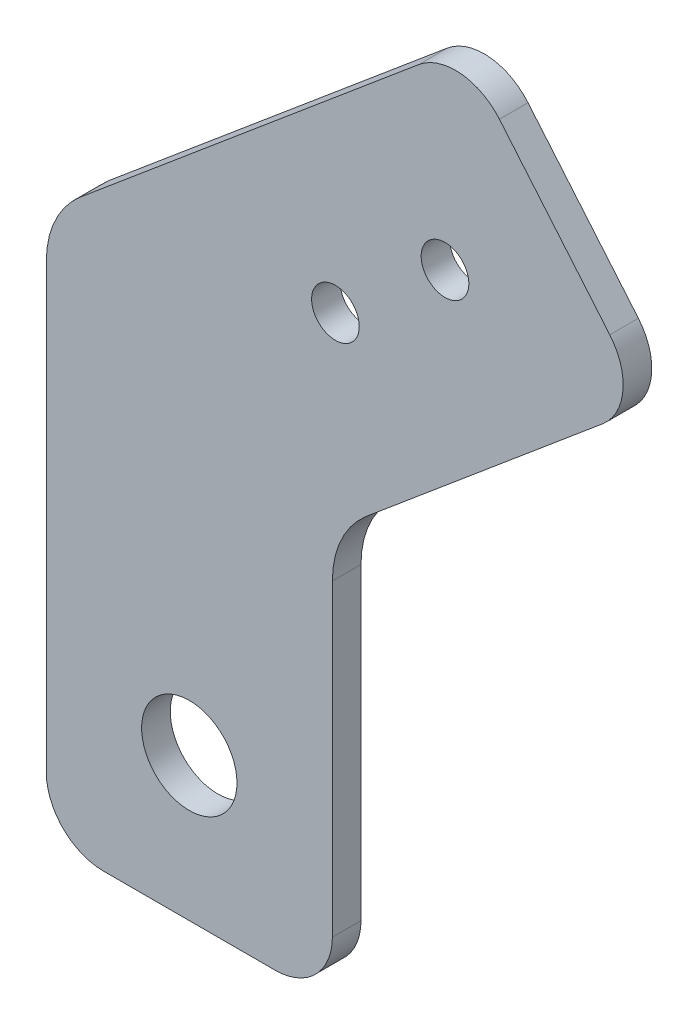
ISO-10303-21;
HEADER;
FILE_DESCRIPTION(('STEP AP214'),'2;1');
FILE_NAME('part.step','',(''),(''),'','','');
FILE_SCHEMA(('AUTOMOTIVE_DESIGN { 1 0 10303 214 1 1 1 1 }'));
ENDSEC;
DATA;
#1=APPLICATION_CONTEXT('core data for automotive mechanical design processes');
#2=APPLICATION_PROTOCOL_DEFINITION('international standard','automotive_design',2000,#1);
#3=PRODUCT_CONTEXT('',#1,'mechanical');
#4=PRODUCT('Part','Part','',(#3));
#5=PRODUCT_RELATED_PRODUCT_CATEGORY('part','',(#4));
#6=PRODUCT_DEFINITION_FORMATION('','',#4);
#7=PRODUCT_DEFINITION_CONTEXT('part definition',#1,'design');
#8=PRODUCT_DEFINITION('design','',#6,#7);
#9=PRODUCT_DEFINITION_SHAPE('','',#8);
#10=(LENGTH_UNIT() NAMED_UNIT(*) SI_UNIT(.MILLI.,.METRE.));
#11=(NAMED_UNIT(*) PLANE_ANGLE_UNIT() SI_UNIT($,.RADIAN.));
#12=(NAMED_UNIT(*) SI_UNIT($,.STERADIAN.) SOLID_ANGLE_UNIT());
#13=UNCERTAINTY_MEASURE_WITH_UNIT(LENGTH_MEASURE(1.E-05),#10,'distance_accuracy_value','');
#14=(GEOMETRIC_REPRESENTATION_CONTEXT(3) GLOBAL_UNCERTAINTY_ASSIGNED_CONTEXT((#13)) GLOBAL_UNIT_ASSIGNED_CONTEXT((#10,
#11,#12)) REPRESENTATION_CONTEXT('',''));
#15=CARTESIAN_POINT('',(0.,0.,0.));
#16=DIRECTION('',(0.,0.,1.));
#17=DIRECTION('',(1.,0.,0.));
#18=AXIS2_PLACEMENT_3D('',#15,#16,#17);
#19=CARTESIAN_POINT('',(-47.3022221559489,-76.1393804843269,-3.));
#20=DIRECTION('',(0.,0.,1.));
#21=DIRECTION('',(1.,0.,0.));
#22=AXIS2_PLACEMENT_3D('',#19,#20,#21);
#23=CYLINDRICAL_SURFACE('',#22,6.);
#24=CARTESIAN_POINT('',(-47.3022221559489,-76.1393804843269,0.));
#25=DIRECTION('',(0.,0.,1.));
#26=DIRECTION('',(-1.,0.,0.));
#27=AXIS2_PLACEMENT_3D('',#24,#25,#26);
#28=CIRCLE('',#27,6.);
#29=CARTESIAN_POINT('',(-53.3022221559489,-76.1393804843269,0.));
#30=VERTEX_POINT('',#29);
#31=CARTESIAN_POINT('',(-47.3022221559489,-82.1393804843269,0.));
#32=VERTEX_POINT('',#31);
#33=EDGE_CURVE('E156',#30,#32,#28,.T.);
#34=ORIENTED_EDGE('',*,*,#33,.F.);
#35=DIRECTION('',(0.,0.,1.));
#36=VECTOR('',#35,1.);
#37=CARTESIAN_POINT('',(-53.3022221559489,-76.1393804843269,-3.));
#38=LINE('',#37,#36);
#39=CARTESIAN_POINT('',(-53.3022221559489,-76.1393804843269,-3.));
#40=VERTEX_POINT('',#39);
#41=EDGE_CURVE('E11',#40,#30,#38,.T.);
#42=ORIENTED_EDGE('',*,*,#41,.F.);
#43=CARTESIAN_POINT('',(-47.3022221559489,-76.1393804843269,-3.));
#44=DIRECTION('',(0.,0.,1.));
#45=DIRECTION('',(-1.,0.,0.));
#46=AXIS2_PLACEMENT_3D('',#43,#44,#45);
#47=CIRCLE('',#46,6.);
#48=CARTESIAN_POINT('',(-47.3022221559489,-82.1393804843269,-3.));
#49=VERTEX_POINT('',#48);
#50=EDGE_CURVE('E187',#40,#49,#47,.T.);
#51=ORIENTED_EDGE('',*,*,#50,.T.);
#52=DIRECTION('',(0.,0.,1.));
#53=VECTOR('',#52,1.);
#54=CARTESIAN_POINT('',(-47.3022221559489,-82.1393804843269,-3.));
#55=LINE('',#54,#53);
#56=EDGE_CURVE('E38',#49,#32,#55,.T.);
#57=ORIENTED_EDGE('',*,*,#56,.T.);
#58=EDGE_LOOP('',(#34,#42,#51,#57));
#59=FACE_BOUND('',#58,.T.);
#60=ADVANCED_FACE('F35',(#59),#23,.T.);
#61=CARTESIAN_POINT('',(-53.3022221559489,-76.1393804843269,-3.));
#62=DIRECTION('',(-1.,0.,0.));
#63=DIRECTION('',(0.,0.,1.));
#64=AXIS2_PLACEMENT_3D('',#61,#62,#63);
#65=PLANE('',#64);
#66=DIRECTION('',(0.,-1.,0.));
#67=VECTOR('',#66,1.);
#68=CARTESIAN_POINT('',(-53.3022221559489,-76.1393804843269,0.));
#69=LINE('',#68,#67);
#70=CARTESIAN_POINT('',(-53.3022221559489,-29.8078421935519,0.));
#71=VERTEX_POINT('',#70);
#72=EDGE_CURVE('E90',#71,#30,#69,.T.);
#73=ORIENTED_EDGE('',*,*,#72,.F.);
#74=DIRECTION('',(0.,0.,1.));
#75=VECTOR('',#74,1.);
#76=CARTESIAN_POINT('',(-53.3022221559489,-29.8078421935519,-3.));
#77=LINE('',#76,#75);
#78=CARTESIAN_POINT('',(-53.3022221559489,-29.8078421935519,-3.));
#79=VERTEX_POINT('',#78);
#80=EDGE_CURVE('E44',#79,#71,#77,.T.);
#81=ORIENTED_EDGE('',*,*,#80,.F.);
#82=DIRECTION('',(0.,-1.,0.));
#83=VECTOR('',#82,1.);
#84=CARTESIAN_POINT('',(-53.3022221559489,-29.8078421935519,-3.));
#85=LINE('',#84,#83);
#86=EDGE_CURVE('E52',#79,#40,#85,.T.);
#87=ORIENTED_EDGE('',*,*,#86,.T.);
#88=ORIENTED_EDGE('',*,*,#41,.T.);
#89=EDGE_LOOP('',(#73,#81,#87,#88));
#90=FACE_BOUND('',#89,.T.);
#91=ADVANCED_FACE('F283',(#90),#65,.T.);
#92=CARTESIAN_POINT('',(-43.3022221559489,-29.8078421935519,-3.));
#93=DIRECTION('',(0.,0.,1.));
#94=DIRECTION('',(1.,0.,0.));
#95=AXIS2_PLACEMENT_3D('',#92,#93,#94);
#96=CYLINDRICAL_SURFACE('',#95,10.);
#97=CARTESIAN_POINT('',(-43.3022221559489,-29.8078421935519,0.));
#98=DIRECTION('',(0.,0.,1.));
#99=DIRECTION('',(1.,0.,0.));
#100=AXIS2_PLACEMENT_3D('',#97,#98,#99);
#101=CIRCLE('',#100,10.);
#102=CARTESIAN_POINT('',(-49.7300982528143,-22.1473977623621,0.));
#103=VERTEX_POINT('',#102);
#104=EDGE_CURVE('E133',#103,#71,#101,.T.);
#105=ORIENTED_EDGE('',*,*,#104,.F.);
#106=DIRECTION('',(0.,0.,1.));
#107=VECTOR('',#106,1.);
#108=CARTESIAN_POINT('',(-49.7300982528143,-22.1473977623621,-3.));
#109=LINE('',#108,#107);
#110=CARTESIAN_POINT('',(-49.7300982528143,-22.1473977623621,-3.));
#111=VERTEX_POINT('',#110);
#112=EDGE_CURVE('E128',#111,#103,#109,.T.);
#113=ORIENTED_EDGE('',*,*,#112,.F.);
#114=CARTESIAN_POINT('',(-43.3022221559489,-29.8078421935519,-3.));
#115=DIRECTION('',(0.,0.,1.));
#116=DIRECTION('',(1.,0.,0.));
#117=AXIS2_PLACEMENT_3D('',#114,#115,#116);
#118=CIRCLE('',#117,10.);
#119=EDGE_CURVE('E131',#111,#79,#118,.T.);
#120=ORIENTED_EDGE('',*,*,#119,.T.);
#121=ORIENTED_EDGE('',*,*,#80,.T.);
#122=EDGE_LOOP('',(#105,#113,#120,#121));
#123=FACE_BOUND('',#122,.T.);
#124=ADVANCED_FACE('F130',(#123),#96,.T.);
#125=CARTESIAN_POINT('',(-14.2380808040119,7.63394098866545,-3.));
#126=DIRECTION('',(-0.642787609686538,0.766044443118979,0.));
#127=DIRECTION('',(-0.766044443118979,-0.642787609686538,0.));
#128=AXIS2_PLACEMENT_3D('',#125,#126,#127);
#129=PLANE('',#128);
#130=DIRECTION('',(-0.766044443118979,-0.642787609686538,0.));
#131=VECTOR('',#130,1.);
#132=CARTESIAN_POINT('',(-14.2380808040119,7.63394098866545,0.));
#133=LINE('',#132,#131);
#134=CARTESIAN_POINT('',(-14.2380808040119,7.63394098866545,0.));
#135=VERTEX_POINT('',#134);
#136=EDGE_CURVE('E184',#135,#103,#133,.T.);
#137=ORIENTED_EDGE('',*,*,#136,.F.);
#138=DIRECTION('',(0.,0.,1.));
#139=VECTOR('',#138,1.);
#140=CARTESIAN_POINT('',(-14.2380808040119,7.63394098866545,-3.));
#141=LINE('',#140,#139);
#142=CARTESIAN_POINT('',(-14.2380808040119,7.63394098866545,-3.));
#143=VERTEX_POINT('',#142);
#144=EDGE_CURVE('E138',#143,#135,#141,.T.);
#145=ORIENTED_EDGE('',*,*,#144,.F.);
#146=DIRECTION('',(-0.766044443118979,-0.642787609686538,0.));
#147=VECTOR('',#146,1.);
#148=CARTESIAN_POINT('',(-14.2380808040119,7.63394098866545,-3.));
#149=LINE('',#148,#147);
#150=EDGE_CURVE('E145',#143,#111,#149,.T.);
#151=ORIENTED_EDGE('',*,*,#150,.T.);
#152=ORIENTED_EDGE('',*,*,#112,.T.);
#153=EDGE_LOOP('',(#137,#145,#151,#152));
#154=FACE_BOUND('',#153,.T.);
#155=ADVANCED_FACE('F148',(#154),#129,.T.);
#156=CARTESIAN_POINT('',(-10.3813551458927,3.03767432995158,-3.));
#157=DIRECTION('',(0.,0.,1.));
#158=DIRECTION('',(1.,0.,0.));
#159=AXIS2_PLACEMENT_3D('',#156,#157,#158);
#160=CYLINDRICAL_SURFACE('',#159,6.);
#161=CARTESIAN_POINT('',(-10.3813551458927,3.03767432995158,0.));
#162=DIRECTION('',(0.,0.,1.));
#163=DIRECTION('',(-1.,0.,0.));
#164=AXIS2_PLACEMENT_3D('',#161,#162,#163);
#165=CIRCLE('',#164,6.);
#166=CARTESIAN_POINT('',(-5.78508848717884,6.89439998807081,0.));
#167=VERTEX_POINT('',#166);
#168=EDGE_CURVE('E181',#167,#135,#165,.T.);
#169=ORIENTED_EDGE('',*,*,#168,.F.);
#170=DIRECTION('',(0.,0.,1.));
#171=VECTOR('',#170,1.);
#172=CARTESIAN_POINT('',(-5.78508848717884,6.89439998807081,-3.));
#173=LINE('',#172,#171);
#174=CARTESIAN_POINT('',(-5.78508848717884,6.89439998807081,-3.));
#175=VERTEX_POINT('',#174);
#176=EDGE_CURVE('E191',#175,#167,#173,.T.);
#177=ORIENTED_EDGE('',*,*,#176,.F.);
#178=CARTESIAN_POINT('',(-10.3813551458927,3.03767432995158,-3.));
#179=DIRECTION('',(0.,0.,1.));
#180=DIRECTION('',(-1.,0.,0.));
#181=AXIS2_PLACEMENT_3D('',#178,#179,#180);
#182=CIRCLE('',#181,6.);
#183=EDGE_CURVE('E149',#175,#143,#182,.T.);
#184=ORIENTED_EDGE('',*,*,#183,.T.);
#185=ORIENTED_EDGE('',*,*,#144,.T.);
#186=EDGE_LOOP('',(#169,#177,#184,#185));
#187=FACE_BOUND('',#186,.T.);
#188=ADVANCED_FACE('F213',(#187),#160,.T.);
#189=CARTESIAN_POINT('',(5.78508848717885,-6.89439998807081,-3.));
#190=DIRECTION('',(0.766044443118979,0.642787609686538,0.));
#191=DIRECTION('',(-0.642787609686538,0.766044443118979,0.));
#192=AXIS2_PLACEMENT_3D('',#189,#190,#191);
#193=PLANE('',#192);
#194=DIRECTION('',(-0.642787609686538,0.766044443118979,0.));
#195=VECTOR('',#194,1.);
#196=CARTESIAN_POINT('',(5.78508848717885,-6.89439998807081,0.));
#197=LINE('',#196,#195);
#198=CARTESIAN_POINT('',(5.78508848717885,-6.89439998807081,0.));
#199=VERTEX_POINT('',#198);
#200=EDGE_CURVE('E178',#199,#167,#197,.T.);
#201=ORIENTED_EDGE('',*,*,#200,.F.);
#202=DIRECTION('',(0.,0.,1.));
#203=VECTOR('',#202,1.);
#204=CARTESIAN_POINT('',(5.78508848717885,-6.89439998807081,-3.));
#205=LINE('',#204,#203);
#206=CARTESIAN_POINT('',(5.78508848717885,-6.89439998807081,-3.));
#207=VERTEX_POINT('',#206);
#208=EDGE_CURVE('E193',#207,#199,#205,.T.);
#209=ORIENTED_EDGE('',*,*,#208,.F.);
#210=DIRECTION('',(-0.642787609686538,0.766044443118979,0.));
#211=VECTOR('',#210,1.);
#212=CARTESIAN_POINT('',(5.78508848717885,-6.89439998807081,-3.));
#213=LINE('',#212,#211);
#214=EDGE_CURVE('E151',#207,#175,#213,.T.);
#215=ORIENTED_EDGE('',*,*,#214,.T.);
#216=ORIENTED_EDGE('',*,*,#176,.T.);
#217=EDGE_LOOP('',(#201,#209,#215,#216));
#218=FACE_BOUND('',#217,.T.);
#219=ADVANCED_FACE('F219',(#218),#193,.T.);
#220=CARTESIAN_POINT('',(1.18882182846497,-10.75112564619,-3.));
#221=DIRECTION('',(0.,0.,1.));
#222=DIRECTION('',(1.,0.,0.));
#223=AXIS2_PLACEMENT_3D('',#220,#221,#222);
#224=CYLINDRICAL_SURFACE('',#223,6.);
#225=CARTESIAN_POINT('',(1.18882182846497,-10.75112564619,0.));
#226=DIRECTION('',(0.,0.,1.));
#227=DIRECTION('',(1.,0.,0.));
#228=AXIS2_PLACEMENT_3D('',#225,#226,#227);
#229=CIRCLE('',#228,6.);
#230=CARTESIAN_POINT('',(5.0455474865842,-15.3473923049039,0.));
#231=VERTEX_POINT('',#230);
#232=EDGE_CURVE('E175',#231,#199,#229,.T.);
#233=ORIENTED_EDGE('',*,*,#232,.F.);
#234=DIRECTION('',(0.,0.,1.));
#235=VECTOR('',#234,1.);
#236=CARTESIAN_POINT('',(5.0455474865842,-15.3473923049039,-3.));
#237=LINE('',#236,#235);
#238=CARTESIAN_POINT('',(5.0455474865842,-15.3473923049039,-3.));
#239=VERTEX_POINT('',#238);
#240=EDGE_CURVE('E195',#239,#231,#237,.T.);
#241=ORIENTED_EDGE('',*,*,#240,.F.);
#242=CARTESIAN_POINT('',(1.18882182846497,-10.75112564619,-3.));
#243=DIRECTION('',(0.,0.,1.));
#244=DIRECTION('',(1.,0.,0.));
#245=AXIS2_PLACEMENT_3D('',#242,#243,#244);
#246=CIRCLE('',#245,6.);
#247=EDGE_CURVE('E220',#239,#207,#246,.T.);
#248=ORIENTED_EDGE('',*,*,#247,.T.);
#249=ORIENTED_EDGE('',*,*,#208,.T.);
#250=EDGE_LOOP('',(#233,#241,#248,#249));
#251=FACE_BOUND('',#250,.T.);
#252=ADVANCED_FACE('F299',(#251),#224,.T.);
#253=CARTESIAN_POINT('',(5.0455474865842,-15.3473923049039,-3.));
#254=DIRECTION('',(0.642787609686538,-0.766044443118979,0.));
#255=DIRECTION('',(0.766044443118979,0.642787609686538,0.));
#256=AXIS2_PLACEMENT_3D('',#253,#254,#255);
#257=PLANE('',#256);
#258=DIRECTION('',(0.766044443118979,0.642787609686538,0.));
#259=VECTOR('',#258,1.);
#260=CARTESIAN_POINT('',(5.0455474865842,-15.3473923049039,0.));
#261=LINE('',#260,#259);
#262=CARTESIAN_POINT('',(-19.7300982528143,-36.1366275070121,0.));
#263=VERTEX_POINT('',#262);
#264=EDGE_CURVE('E172',#263,#231,#261,.T.);
#265=ORIENTED_EDGE('',*,*,#264,.F.);
#266=DIRECTION('',(0.,0.,1.));
#267=VECTOR('',#266,1.);
#268=CARTESIAN_POINT('',(-19.7300982528143,-36.1366275070121,-3.));
#269=LINE('',#268,#267);
#270=CARTESIAN_POINT('',(-19.7300982528143,-36.1366275070121,-3.));
#271=VERTEX_POINT('',#270);
#272=EDGE_CURVE('E197',#271,#263,#269,.T.);
#273=ORIENTED_EDGE('',*,*,#272,.F.);
#274=DIRECTION('',(0.766044443118979,0.642787609686538,0.));
#275=VECTOR('',#274,1.);
#276=CARTESIAN_POINT('',(5.0455474865842,-15.3473923049039,-3.));
#277=LINE('',#276,#275);
#278=EDGE_CURVE('E221',#271,#239,#277,.T.);
#279=ORIENTED_EDGE('',*,*,#278,.T.);
#280=ORIENTED_EDGE('',*,*,#240,.T.);
#281=EDGE_LOOP('',(#265,#273,#279,#280));
#282=FACE_BOUND('',#281,.T.);
#283=ADVANCED_FACE('F302',(#282),#257,.T.);
#284=CARTESIAN_POINT('',(-13.3022221559489,-43.7970719382019,-3.));
#285=DIRECTION('',(0.,0.,1.));
#286=DIRECTION('',(1.,0.,0.));
#287=AXIS2_PLACEMENT_3D('',#284,#285,#286);
#288=CYLINDRICAL_SURFACE('',#287,10.);
#289=CARTESIAN_POINT('',(-13.3022221559489,-43.7970719382019,0.));
#290=DIRECTION('',(0.,0.,-1.));
#291=DIRECTION('',(1.,0.,0.));
#292=AXIS2_PLACEMENT_3D('',#289,#290,#291);
#293=CIRCLE('',#292,10.);
#294=CARTESIAN_POINT('',(-23.302222155949,-43.7970719382019,0.));
#295=VERTEX_POINT('',#294);
#296=EDGE_CURVE('E169',#295,#263,#293,.T.);
#297=ORIENTED_EDGE('',*,*,#296,.F.);
#298=DIRECTION('',(0.,0.,1.));
#299=VECTOR('',#298,1.);
#300=CARTESIAN_POINT('',(-23.302222155949,-43.7970719382019,-3.));
#301=LINE('',#300,#299);
#302=CARTESIAN_POINT('',(-23.302222155949,-43.7970719382019,-3.));
#303=VERTEX_POINT('',#302);
#304=EDGE_CURVE('E199',#303,#295,#301,.T.);
#305=ORIENTED_EDGE('',*,*,#304,.F.);
#306=CARTESIAN_POINT('',(-13.3022221559489,-43.7970719382019,-3.));
#307=DIRECTION('',(0.,0.,-1.));
#308=DIRECTION('',(1.,0.,0.));
#309=AXIS2_PLACEMENT_3D('',#306,#307,#308);
#310=CIRCLE('',#309,10.);
#311=EDGE_CURVE('E226',#303,#271,#310,.T.);
#312=ORIENTED_EDGE('',*,*,#311,.T.);
#313=ORIENTED_EDGE('',*,*,#272,.T.);
#314=EDGE_LOOP('',(#297,#305,#312,#313));
#315=FACE_BOUND('',#314,.T.);
#316=ADVANCED_FACE('F306',(#315),#288,.F.);
#317=CARTESIAN_POINT('',(-23.302222155949,-43.7970719382019,-3.));
#318=DIRECTION('',(1.,0.,0.));
#319=DIRECTION('',(0.,1.,0.));
#320=AXIS2_PLACEMENT_3D('',#317,#318,#319);
#321=PLANE('',#320);
#322=DIRECTION('',(0.,1.,0.));
#323=VECTOR('',#322,1.);
#324=CARTESIAN_POINT('',(-23.302222155949,-43.7970719382019,0.));
#325=LINE('',#324,#323);
#326=CARTESIAN_POINT('',(-23.3022221559489,-76.1393804843269,0.));
#327=VERTEX_POINT('',#326);
#328=EDGE_CURVE('E166',#327,#295,#325,.T.);
#329=ORIENTED_EDGE('',*,*,#328,.F.);
#330=DIRECTION('',(0.,0.,1.));
#331=VECTOR('',#330,1.);
#332=CARTESIAN_POINT('',(-23.3022221559489,-76.1393804843269,-3.));
#333=LINE('',#332,#331);
#334=CARTESIAN_POINT('',(-23.3022221559489,-76.1393804843269,-3.));
#335=VERTEX_POINT('',#334);
#336=EDGE_CURVE('E201',#335,#327,#333,.T.);
#337=ORIENTED_EDGE('',*,*,#336,.F.);
#338=DIRECTION('',(0.,1.,0.));
#339=VECTOR('',#338,1.);
#340=CARTESIAN_POINT('',(-23.3022221559489,-48.561641660225,-3.));
#341=LINE('',#340,#339);
#342=EDGE_CURVE('E229',#335,#303,#341,.T.);
#343=ORIENTED_EDGE('',*,*,#342,.T.);
#344=ORIENTED_EDGE('',*,*,#304,.T.);
#345=EDGE_LOOP('',(#329,#337,#343,#344));
#346=FACE_BOUND('',#345,.T.);
#347=ADVANCED_FACE('F310',(#346),#321,.T.);
#348=CARTESIAN_POINT('',(-29.3022221559489,-76.1393804843269,-3.));
#349=DIRECTION('',(0.,0.,1.));
#350=DIRECTION('',(1.,0.,0.));
#351=AXIS2_PLACEMENT_3D('',#348,#349,#350);
#352=CYLINDRICAL_SURFACE('',#351,6.);
#353=CARTESIAN_POINT('',(-29.3022221559489,-76.1393804843269,0.));
#354=DIRECTION('',(0.,0.,1.));
#355=DIRECTION('',(-1.,0.,0.));
#356=AXIS2_PLACEMENT_3D('',#353,#354,#355);
#357=CIRCLE('',#356,6.);
#358=CARTESIAN_POINT('',(-29.3022221559489,-82.1393804843269,0.));
#359=VERTEX_POINT('',#358);
#360=EDGE_CURVE('E163',#359,#327,#357,.T.);
#361=ORIENTED_EDGE('',*,*,#360,.F.);
#362=DIRECTION('',(0.,0.,1.));
#363=VECTOR('',#362,1.);
#364=CARTESIAN_POINT('',(-29.3022221559489,-82.1393804843269,-3.));
#365=LINE('',#364,#363);
#366=CARTESIAN_POINT('',(-29.3022221559489,-82.1393804843269,-3.));
#367=VERTEX_POINT('',#366);
#368=EDGE_CURVE('E203',#367,#359,#365,.T.);
#369=ORIENTED_EDGE('',*,*,#368,.F.);
#370=CARTESIAN_POINT('',(-29.3022221559489,-76.1393804843269,-3.));
#371=DIRECTION('',(0.,0.,1.));
#372=DIRECTION('',(-1.,0.,0.));
#373=AXIS2_PLACEMENT_3D('',#370,#371,#372);
#374=CIRCLE('',#373,6.);
#375=EDGE_CURVE('E231',#367,#335,#374,.T.);
#376=ORIENTED_EDGE('',*,*,#375,.T.);
#377=ORIENTED_EDGE('',*,*,#336,.T.);
#378=EDGE_LOOP('',(#361,#369,#376,#377));
#379=FACE_BOUND('',#378,.T.);
#380=ADVANCED_FACE('F314',(#379),#352,.T.);
#381=CARTESIAN_POINT('',(-29.3022221559489,-82.1393804843269,-3.));
#382=DIRECTION('',(0.,-1.,0.));
#383=DIRECTION('',(0.,0.,-1.));
#384=AXIS2_PLACEMENT_3D('',#381,#382,#383);
#385=PLANE('',#384);
#386=DIRECTION('',(1.,0.,0.));
#387=VECTOR('',#386,1.);
#388=CARTESIAN_POINT('',(-29.3022221559489,-82.1393804843269,0.));
#389=LINE('',#388,#387);
#390=EDGE_CURVE('E159',#32,#359,#389,.T.);
#391=ORIENTED_EDGE('',*,*,#390,.F.);
#392=ORIENTED_EDGE('',*,*,#56,.F.);
#393=DIRECTION('',(1.,0.,0.));
#394=VECTOR('',#393,1.);
#395=CARTESIAN_POINT('',(-29.3022221559489,-82.1393804843269,-3.));
#396=LINE('',#395,#394);
#397=EDGE_CURVE('E234',#49,#367,#396,.T.);
#398=ORIENTED_EDGE('',*,*,#397,.T.);
#399=ORIENTED_EDGE('',*,*,#368,.T.);
#400=EDGE_LOOP('',(#391,#392,#398,#399));
#401=FACE_BOUND('',#400,.T.);
#402=ADVANCED_FACE('F207',(#401),#385,.T.);
#403=CARTESIAN_POINT('',(-47.3022221559489,-76.1393804843269,-3.));
#404=DIRECTION('',(0.,0.,-1.));
#405=DIRECTION('',(-1.,0.,0.));
#406=AXIS2_PLACEMENT_3D('',#403,#404,#405);
#407=PLANE('',#406);
#408=CARTESIAN_POINT('',(-22.9813332935694,-19.2836282905961,-3.));
#409=DIRECTION('',(0.,0.,1.));
#410=DIRECTION('',(1.,0.,0.));
#411=AXIS2_PLACEMENT_3D('',#408,#409,#410);
#412=CIRCLE('',#411,2.5);
#413=CARTESIAN_POINT('',(-20.4813332935694,-19.2836282905961,-3.));
#414=VERTEX_POINT('',#413);
#415=EDGE_CURVE('E246',#414,#414,#412,.T.);
#416=ORIENTED_EDGE('',*,*,#415,.T.);
#417=EDGE_LOOP('',(#416));
#418=FACE_BOUND('',#417,.T.);
#419=CARTESIAN_POINT('',(-11.4906666467847,-9.64181414529807,-3.));
#420=DIRECTION('',(0.,0.,1.));
#421=DIRECTION('',(1.,0.,0.));
#422=AXIS2_PLACEMENT_3D('',#419,#420,#421);
#423=CIRCLE('',#422,2.5);
#424=CARTESIAN_POINT('',(-8.99066664678469,-9.64181414529807,-3.));
#425=VERTEX_POINT('',#424);
#426=EDGE_CURVE('E240',#425,#425,#423,.T.);
#427=ORIENTED_EDGE('',*,*,#426,.T.);
#428=EDGE_LOOP('',(#427));
#429=FACE_BOUND('',#428,.T.);
#430=CARTESIAN_POINT('',(-38.3022221559489,-67.1393804843269,-3.));
#431=DIRECTION('',(0.,0.,1.));
#432=DIRECTION('',(1.,0.,0.));
#433=AXIS2_PLACEMENT_3D('',#430,#431,#432);
#434=CIRCLE('',#433,5.);
#435=CARTESIAN_POINT('',(-33.3022221559489,-67.1393804843269,-3.));
#436=VERTEX_POINT('',#435);
#437=EDGE_CURVE('E160',#436,#436,#434,.T.);
#438=ORIENTED_EDGE('',*,*,#437,.T.);
#439=EDGE_LOOP('',(#438));
#440=FACE_BOUND('',#439,.T.);
#441=ORIENTED_EDGE('',*,*,#50,.F.);
#442=ORIENTED_EDGE('',*,*,#86,.F.);
#443=ORIENTED_EDGE('',*,*,#119,.F.);
#444=ORIENTED_EDGE('',*,*,#150,.F.);
#445=ORIENTED_EDGE('',*,*,#183,.F.);
#446=ORIENTED_EDGE('',*,*,#214,.F.);
#447=ORIENTED_EDGE('',*,*,#247,.F.);
#448=ORIENTED_EDGE('',*,*,#278,.F.);
#449=ORIENTED_EDGE('',*,*,#311,.F.);
#450=ORIENTED_EDGE('',*,*,#342,.F.);
#451=ORIENTED_EDGE('',*,*,#375,.F.);
#452=ORIENTED_EDGE('',*,*,#397,.F.);
#453=EDGE_LOOP('',(#441,#442,#443,#444,#445,#446,#447,#448,#449,#450,#451,#452));
#454=FACE_BOUND('',#453,.T.);
#455=ADVANCED_FACE('F143',(#418,#429,#440,#454),#407,.T.);
#456=CARTESIAN_POINT('',(-47.3022221559489,-76.1393804843269,0.));
#457=DIRECTION('',(0.,0.,-1.));
#458=DIRECTION('',(-1.,0.,0.));
#459=AXIS2_PLACEMENT_3D('',#456,#457,#458);
#460=PLANE('',#459);
#461=CARTESIAN_POINT('',(-22.9813332935694,-19.2836282905961,0.));
#462=DIRECTION('',(0.,0.,1.));
#463=DIRECTION('',(1.,0.,0.));
#464=AXIS2_PLACEMENT_3D('',#461,#462,#463);
#465=CIRCLE('',#464,2.5);
#466=CARTESIAN_POINT('',(-20.4813332935694,-19.2836282905961,0.));
#467=VERTEX_POINT('',#466);
#468=EDGE_CURVE('E249',#467,#467,#465,.T.);
#469=ORIENTED_EDGE('',*,*,#468,.F.);
#470=EDGE_LOOP('',(#469));
#471=FACE_BOUND('',#470,.T.);
#472=CARTESIAN_POINT('',(-11.4906666467847,-9.64181414529807,0.));
#473=DIRECTION('',(0.,0.,1.));
#474=DIRECTION('',(1.,0.,0.));
#475=AXIS2_PLACEMENT_3D('',#472,#473,#474);
#476=CIRCLE('',#475,2.5);
#477=CARTESIAN_POINT('',(-8.99066664678469,-9.64181414529807,0.));
#478=VERTEX_POINT('',#477);
#479=EDGE_CURVE('E243',#478,#478,#476,.T.);
#480=ORIENTED_EDGE('',*,*,#479,.F.);
#481=EDGE_LOOP('',(#480));
#482=FACE_BOUND('',#481,.T.);
#483=CARTESIAN_POINT('',(-38.3022221559489,-67.1393804843269,0.));
#484=DIRECTION('',(0.,0.,1.));
#485=DIRECTION('',(1.,0.,0.));
#486=AXIS2_PLACEMENT_3D('',#483,#484,#485);
#487=CIRCLE('',#486,5.);
#488=CARTESIAN_POINT('',(-33.3022221559489,-67.1393804843269,0.));
#489=VERTEX_POINT('',#488);
#490=EDGE_CURVE('E237',#489,#489,#487,.T.);
#491=ORIENTED_EDGE('',*,*,#490,.F.);
#492=EDGE_LOOP('',(#491));
#493=FACE_BOUND('',#492,.T.);
#494=ORIENTED_EDGE('',*,*,#33,.T.);
#495=ORIENTED_EDGE('',*,*,#390,.T.);
#496=ORIENTED_EDGE('',*,*,#360,.T.);
#497=ORIENTED_EDGE('',*,*,#328,.T.);
#498=ORIENTED_EDGE('',*,*,#296,.T.);
#499=ORIENTED_EDGE('',*,*,#264,.T.);
#500=ORIENTED_EDGE('',*,*,#232,.T.);
#501=ORIENTED_EDGE('',*,*,#200,.T.);
#502=ORIENTED_EDGE('',*,*,#168,.T.);
#503=ORIENTED_EDGE('',*,*,#136,.T.);
#504=ORIENTED_EDGE('',*,*,#104,.T.);
#505=ORIENTED_EDGE('',*,*,#72,.T.);
#506=EDGE_LOOP('',(#494,#495,#496,#497,#498,#499,#500,#501,#502,#503,#504,#505));
#507=FACE_BOUND('',#506,.T.);
#508=ADVANCED_FACE('F209',(#471,#482,#493,#507),#460,.F.);
#509=CARTESIAN_POINT('',(-38.3022221559489,-67.1393804843269,-3.));
#510=DIRECTION('',(0.,0.,1.));
#511=DIRECTION('',(1.,0.,0.));
#512=AXIS2_PLACEMENT_3D('',#509,#510,#511);
#513=CYLINDRICAL_SURFACE('',#512,5.);
#514=ORIENTED_EDGE('',*,*,#437,.F.);
#515=EDGE_LOOP('',(#514));
#516=FACE_BOUND('',#515,.T.);
#517=ORIENTED_EDGE('',*,*,#490,.T.);
#518=EDGE_LOOP('',(#517));
#519=FACE_BOUND('',#518,.T.);
#520=ADVANCED_FACE('F266',(#516,#519),#513,.F.);
#521=CARTESIAN_POINT('',(-11.4906666467847,-9.64181414529807,-3.));
#522=DIRECTION('',(0.,0.,1.));
#523=DIRECTION('',(1.,0.,0.));
#524=AXIS2_PLACEMENT_3D('',#521,#522,#523);
#525=CYLINDRICAL_SURFACE('',#524,2.5);
#526=ORIENTED_EDGE('',*,*,#426,.F.);
#527=EDGE_LOOP('',(#526));
#528=FACE_BOUND('',#527,.T.);
#529=ORIENTED_EDGE('',*,*,#479,.T.);
#530=EDGE_LOOP('',(#529));
#531=FACE_BOUND('',#530,.T.);
#532=ADVANCED_FACE('F260',(#528,#531),#525,.F.);
#533=CARTESIAN_POINT('',(-22.9813332935694,-19.2836282905961,-3.));
#534=DIRECTION('',(0.,0.,1.));
#535=DIRECTION('',(1.,0.,0.));
#536=AXIS2_PLACEMENT_3D('',#533,#534,#535);
#537=CYLINDRICAL_SURFACE('',#536,2.5);
#538=ORIENTED_EDGE('',*,*,#415,.F.);
#539=EDGE_LOOP('',(#538));
#540=FACE_BOUND('',#539,.T.);
#541=ORIENTED_EDGE('',*,*,#468,.T.);
#542=EDGE_LOOP('',(#541));
#543=FACE_BOUND('',#542,.T.);
#544=ADVANCED_FACE('F257',(#540,#543),#537,.F.);
#545=CLOSED_SHELL('',(#60,#91,#124,#155,#188,#219,#252,#283,#316,#347,#380,#402,#455,#508,#520,
#532,#544));
#546=MANIFOLD_SOLID_BREP('B2',#545);
#547=ADVANCED_BREP_SHAPE_REPRESENTATION('',(#18,#546),#14);
#548=SHAPE_DEFINITION_REPRESENTATION(#9,#547);
ENDSEC;
END-ISO-10303-21;
